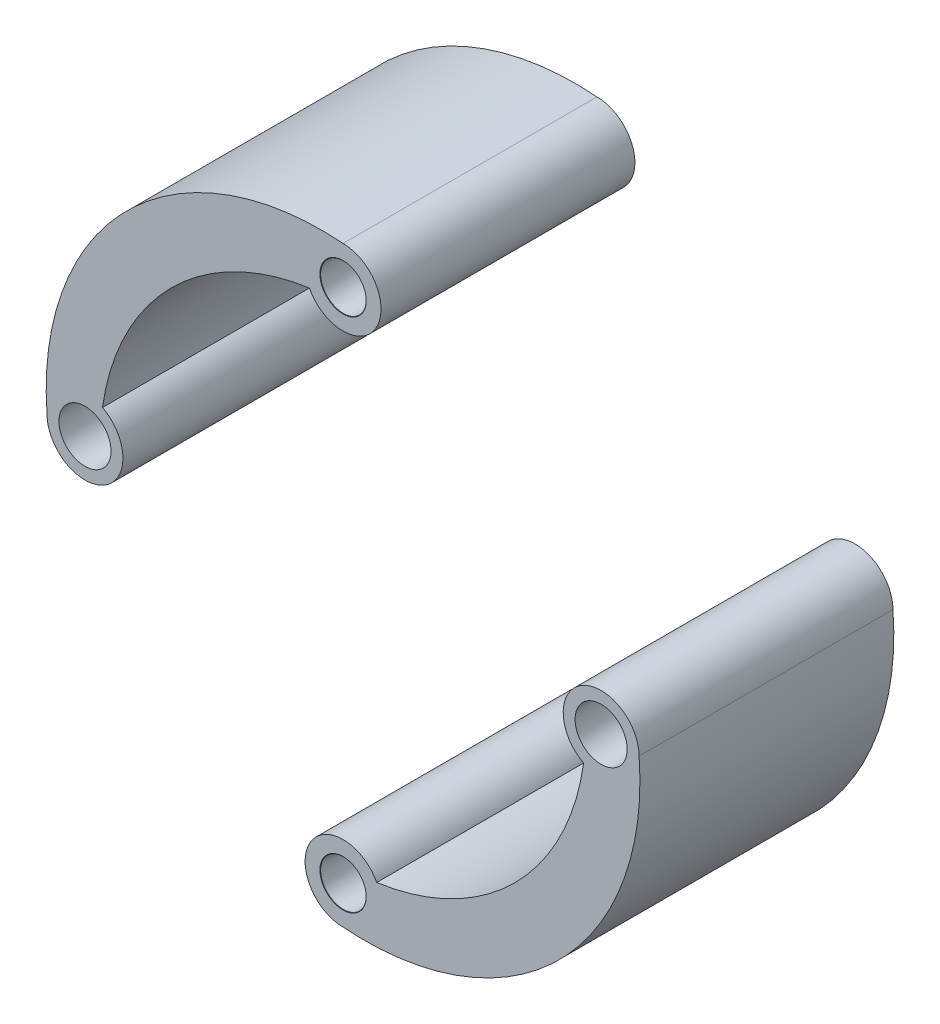
ISO-10303-21;
HEADER;
FILE_DESCRIPTION(('STEP AP214'),'2;1');
FILE_NAME('part.step','',(''),(''),'','','');
FILE_SCHEMA(('AUTOMOTIVE_DESIGN { 1 0 10303 214 1 1 1 1 }'));
ENDSEC;
DATA;
#1=APPLICATION_CONTEXT('core data for automotive mechanical design processes');
#2=APPLICATION_PROTOCOL_DEFINITION('international standard','automotive_design',2000,#1);
#3=PRODUCT_CONTEXT('',#1,'mechanical');
#4=PRODUCT('Part','Part','',(#3));
#5=PRODUCT_RELATED_PRODUCT_CATEGORY('part','',(#4));
#6=PRODUCT_DEFINITION_FORMATION('','',#4);
#7=PRODUCT_DEFINITION_CONTEXT('part definition',#1,'design');
#8=PRODUCT_DEFINITION('design','',#6,#7);
#9=PRODUCT_DEFINITION_SHAPE('','',#8);
#10=(LENGTH_UNIT() NAMED_UNIT(*) SI_UNIT(.MILLI.,.METRE.));
#11=(NAMED_UNIT(*) PLANE_ANGLE_UNIT() SI_UNIT($,.RADIAN.));
#12=(NAMED_UNIT(*) SI_UNIT($,.STERADIAN.) SOLID_ANGLE_UNIT());
#13=UNCERTAINTY_MEASURE_WITH_UNIT(LENGTH_MEASURE(1.E-05),#10,'distance_accuracy_value','');
#14=(GEOMETRIC_REPRESENTATION_CONTEXT(3) GLOBAL_UNCERTAINTY_ASSIGNED_CONTEXT((#13)) GLOBAL_UNIT_ASSIGNED_CONTEXT((#10,
#11,#12)) REPRESENTATION_CONTEXT('',''));
#15=CARTESIAN_POINT('',(0.,0.,0.));
#16=DIRECTION('',(0.,0.,1.));
#17=DIRECTION('',(1.,0.,0.));
#18=AXIS2_PLACEMENT_3D('',#15,#16,#17);
#19=CARTESIAN_POINT('',(0.,-17.,16.7224));
#20=DIRECTION('',(0.,0.,-1.));
#21=DIRECTION('',(-1.,0.,0.));
#22=AXIS2_PLACEMENT_3D('',#19,#20,#21);
#23=CYLINDRICAL_SURFACE('',#22,2.5);
#24=CARTESIAN_POINT('',(0.,-17.,0.));
#25=DIRECTION('',(0.,0.,1.));
#26=DIRECTION('',(1.,0.,0.));
#27=AXIS2_PLACEMENT_3D('',#24,#25,#26);
#28=CIRCLE('',#27,2.5);
#29=CARTESIAN_POINT('',(2.21750613922682,-15.8455882352941,0.));
#30=VERTEX_POINT('',#29);
#31=CARTESIAN_POINT('',(0.,-19.5,0.));
#32=VERTEX_POINT('',#31);
#33=EDGE_CURVE('E149',#30,#32,#28,.T.);
#34=ORIENTED_EDGE('',*,*,#33,.T.);
#35=DIRECTION('',(0.,0.,-1.));
#36=VECTOR('',#35,1.);
#37=CARTESIAN_POINT('',(0.,-19.5,16.7224));
#38=LINE('',#37,#36);
#39=CARTESIAN_POINT('',(0.,-19.5,16.7224));
#40=VERTEX_POINT('',#39);
#41=EDGE_CURVE('E13',#40,#32,#38,.T.);
#42=ORIENTED_EDGE('',*,*,#41,.F.);
#43=CARTESIAN_POINT('',(0.,-17.,16.7224));
#44=DIRECTION('',(0.,0.,1.));
#45=DIRECTION('',(1.,0.,0.));
#46=AXIS2_PLACEMENT_3D('',#43,#44,#45);
#47=CIRCLE('',#46,2.5);
#48=CARTESIAN_POINT('',(2.21750613922682,-15.8455882352941,16.7224));
#49=VERTEX_POINT('',#48);
#50=EDGE_CURVE('E133',#49,#40,#47,.T.);
#51=ORIENTED_EDGE('',*,*,#50,.F.);
#52=DIRECTION('',(0.,0.,-1.));
#53=VECTOR('',#52,1.);
#54=CARTESIAN_POINT('',(2.21750613922682,-15.8455882352941,16.7224));
#55=LINE('',#54,#53);
#56=EDGE_CURVE('E145',#49,#30,#55,.T.);
#57=ORIENTED_EDGE('',*,*,#56,.T.);
#58=EDGE_LOOP('',(#34,#42,#51,#57));
#59=FACE_BOUND('',#58,.T.);
#60=ADVANCED_FACE('F81',(#59),#23,.T.);
#61=CARTESIAN_POINT('',(1.4142135623731,-1.41421356237309,16.7224));
#62=DIRECTION('',(0.,0.,-1.));
#63=DIRECTION('',(-1.,0.,0.));
#64=AXIS2_PLACEMENT_3D('',#61,#62,#63);
#65=CYLINDRICAL_SURFACE('',#64,18.1409942138641);
#66=CARTESIAN_POINT('',(1.4142135623731,-1.41421356237309,0.));
#67=DIRECTION('',(0.,0.,1.));
#68=DIRECTION('',(1.,0.,0.));
#69=AXIS2_PLACEMENT_3D('',#66,#67,#68);
#70=CIRCLE('',#69,18.1409942138641);
#71=CARTESIAN_POINT('',(19.5,0.,0.));
#72=VERTEX_POINT('',#71);
#73=EDGE_CURVE('E138',#32,#72,#70,.T.);
#74=ORIENTED_EDGE('',*,*,#73,.T.);
#75=DIRECTION('',(0.,0.,-1.));
#76=VECTOR('',#75,1.);
#77=CARTESIAN_POINT('',(19.5,0.,16.7224));
#78=LINE('',#77,#76);
#79=CARTESIAN_POINT('',(19.5,0.,16.7224));
#80=VERTEX_POINT('',#79);
#81=EDGE_CURVE('E90',#80,#72,#78,.T.);
#82=ORIENTED_EDGE('',*,*,#81,.F.);
#83=CARTESIAN_POINT('',(1.4142135623731,-1.41421356237309,16.7224));
#84=DIRECTION('',(0.,0.,1.));
#85=DIRECTION('',(1.,0.,0.));
#86=AXIS2_PLACEMENT_3D('',#83,#84,#85);
#87=CIRCLE('',#86,18.1409942138641);
#88=EDGE_CURVE('E128',#40,#80,#87,.T.);
#89=ORIENTED_EDGE('',*,*,#88,.F.);
#90=ORIENTED_EDGE('',*,*,#41,.T.);
#91=EDGE_LOOP('',(#74,#82,#89,#90));
#92=FACE_BOUND('',#91,.T.);
#93=ADVANCED_FACE('F137',(#92),#65,.T.);
#94=CARTESIAN_POINT('',(17.,0.,16.7224));
#95=DIRECTION('',(0.,0.,-1.));
#96=DIRECTION('',(-1.,0.,0.));
#97=AXIS2_PLACEMENT_3D('',#94,#95,#96);
#98=CYLINDRICAL_SURFACE('',#97,2.5);
#99=CARTESIAN_POINT('',(17.,0.,0.));
#100=DIRECTION('',(0.,0.,1.));
#101=DIRECTION('',(1.,0.,0.));
#102=AXIS2_PLACEMENT_3D('',#99,#100,#101);
#103=CIRCLE('',#102,2.5);
#104=CARTESIAN_POINT('',(15.8455882352941,-2.21750613922682,0.));
#105=VERTEX_POINT('',#104);
#106=EDGE_CURVE('E115',#72,#105,#103,.T.);
#107=ORIENTED_EDGE('',*,*,#106,.T.);
#108=DIRECTION('',(0.,0.,-1.));
#109=VECTOR('',#108,1.);
#110=CARTESIAN_POINT('',(15.8455882352941,-2.21750613922682,16.7224));
#111=LINE('',#110,#109);
#112=CARTESIAN_POINT('',(15.8455882352941,-2.21750613922682,16.7224));
#113=VERTEX_POINT('',#112);
#114=EDGE_CURVE('E140',#113,#105,#111,.T.);
#115=ORIENTED_EDGE('',*,*,#114,.F.);
#116=CARTESIAN_POINT('',(17.,0.,16.7224));
#117=DIRECTION('',(0.,0.,1.));
#118=DIRECTION('',(1.,0.,0.));
#119=AXIS2_PLACEMENT_3D('',#116,#117,#118);
#120=CIRCLE('',#119,2.5);
#121=EDGE_CURVE('E131',#80,#113,#120,.T.);
#122=ORIENTED_EDGE('',*,*,#121,.F.);
#123=ORIENTED_EDGE('',*,*,#81,.T.);
#124=EDGE_LOOP('',(#107,#115,#122,#123));
#125=FACE_BOUND('',#124,.T.);
#126=ADVANCED_FACE('F141',(#125),#98,.T.);
#127=CARTESIAN_POINT('',(0.,0.,16.7224));
#128=DIRECTION('',(0.,0.,-1.));
#129=DIRECTION('',(-1.,0.,0.));
#130=AXIS2_PLACEMENT_3D('',#127,#128,#129);
#131=CYLINDRICAL_SURFACE('',#130,16.);
#132=CARTESIAN_POINT('',(0.,0.,0.));
#133=DIRECTION('',(0.,0.,1.));
#134=DIRECTION('',(1.,0.,0.));
#135=AXIS2_PLACEMENT_3D('',#132,#133,#134);
#136=CIRCLE('',#135,16.);
#137=EDGE_CURVE('E121',#105,#30,#136,.F.);
#138=ORIENTED_EDGE('',*,*,#137,.T.);
#139=ORIENTED_EDGE('',*,*,#56,.F.);
#140=CARTESIAN_POINT('',(0.,0.,16.7224));
#141=DIRECTION('',(0.,0.,1.));
#142=DIRECTION('',(1.,0.,0.));
#143=AXIS2_PLACEMENT_3D('',#140,#141,#142);
#144=CIRCLE('',#143,16.);
#145=EDGE_CURVE('E98',#113,#49,#144,.F.);
#146=ORIENTED_EDGE('',*,*,#145,.F.);
#147=ORIENTED_EDGE('',*,*,#114,.T.);
#148=EDGE_LOOP('',(#138,#139,#146,#147));
#149=FACE_BOUND('',#148,.T.);
#150=ADVANCED_FACE('F163',(#149),#131,.F.);
#151=CARTESIAN_POINT('',(0.,0.,16.7224));
#152=DIRECTION('',(0.,0.,1.));
#153=DIRECTION('',(1.,0.,0.));
#154=AXIS2_PLACEMENT_3D('',#151,#152,#153);
#155=PLANE('',#154);
#156=CARTESIAN_POINT('',(17.,0.,16.7224));
#157=DIRECTION('',(0.,0.,1.));
#158=DIRECTION('',(1.,0.,0.));
#159=AXIS2_PLACEMENT_3D('',#156,#157,#158);
#160=CIRCLE('',#159,1.715);
#161=CARTESIAN_POINT('',(18.715,0.,16.7224));
#162=VERTEX_POINT('',#161);
#163=EDGE_CURVE('E181',#162,#162,#160,.T.);
#164=ORIENTED_EDGE('',*,*,#163,.F.);
#165=EDGE_LOOP('',(#164));
#166=FACE_BOUND('',#165,.T.);
#167=CARTESIAN_POINT('',(0.,-17.,16.7224));
#168=DIRECTION('',(0.,0.,1.));
#169=DIRECTION('',(1.,0.,0.));
#170=AXIS2_PLACEMENT_3D('',#167,#168,#169);
#171=CIRCLE('',#170,1.525);
#172=CARTESIAN_POINT('',(1.525,-17.,16.7224));
#173=VERTEX_POINT('',#172);
#174=EDGE_CURVE('E177',#173,#173,#171,.T.);
#175=ORIENTED_EDGE('',*,*,#174,.F.);
#176=EDGE_LOOP('',(#175));
#177=FACE_BOUND('',#176,.T.);
#178=ORIENTED_EDGE('',*,*,#50,.T.);
#179=ORIENTED_EDGE('',*,*,#88,.T.);
#180=ORIENTED_EDGE('',*,*,#121,.T.);
#181=ORIENTED_EDGE('',*,*,#145,.T.);
#182=EDGE_LOOP('',(#178,#179,#180,#181));
#183=FACE_BOUND('',#182,.T.);
#184=ADVANCED_FACE('F129',(#166,#177,#183),#155,.T.);
#185=CARTESIAN_POINT('',(0.,0.,0.));
#186=DIRECTION('',(0.,0.,1.));
#187=DIRECTION('',(1.,0.,0.));
#188=AXIS2_PLACEMENT_3D('',#185,#186,#187);
#189=PLANE('',#188);
#190=CARTESIAN_POINT('',(17.,0.,0.));
#191=DIRECTION('',(0.,0.,-1.));
#192=DIRECTION('',(-1.,0.,0.));
#193=AXIS2_PLACEMENT_3D('',#190,#191,#192);
#194=CIRCLE('',#193,1.715);
#195=CARTESIAN_POINT('',(15.285,0.,0.));
#196=VERTEX_POINT('',#195);
#197=EDGE_CURVE('E186',#196,#196,#194,.T.);
#198=ORIENTED_EDGE('',*,*,#197,.F.);
#199=EDGE_LOOP('',(#198));
#200=FACE_BOUND('',#199,.T.);
#201=CARTESIAN_POINT('',(0.,-17.,0.));
#202=DIRECTION('',(0.,0.,1.));
#203=DIRECTION('',(1.,0.,0.));
#204=AXIS2_PLACEMENT_3D('',#201,#202,#203);
#205=CIRCLE('',#204,1.5);
#206=CARTESIAN_POINT('',(1.5,-17.,0.));
#207=VERTEX_POINT('',#206);
#208=EDGE_CURVE('E153',#207,#207,#205,.T.);
#209=ORIENTED_EDGE('',*,*,#208,.T.);
#210=EDGE_LOOP('',(#209));
#211=FACE_BOUND('',#210,.T.);
#212=ORIENTED_EDGE('',*,*,#33,.F.);
#213=ORIENTED_EDGE('',*,*,#137,.F.);
#214=ORIENTED_EDGE('',*,*,#106,.F.);
#215=ORIENTED_EDGE('',*,*,#73,.F.);
#216=EDGE_LOOP('',(#212,#213,#214,#215));
#217=FACE_BOUND('',#216,.T.);
#218=ADVANCED_FACE('F166',(#200,#211,#217),#189,.F.);
#219=CARTESIAN_POINT('',(0.,-17.,16.7224));
#220=DIRECTION('',(0.,0.,1.));
#221=DIRECTION('',(1.,0.,0.));
#222=AXIS2_PLACEMENT_3D('',#219,#220,#221);
#223=CYLINDRICAL_SURFACE('',#222,1.5);
#224=ORIENTED_EDGE('',*,*,#208,.F.);
#225=EDGE_LOOP('',(#224));
#226=FACE_BOUND('',#225,.T.);
#227=CARTESIAN_POINT('',(0.,-17.,16.7014225092206));
#228=DIRECTION('',(0.,0.,1.));
#229=DIRECTION('',(1.,0.,0.));
#230=AXIS2_PLACEMENT_3D('',#227,#228,#229);
#231=CIRCLE('',#230,1.5);
#232=CARTESIAN_POINT('',(1.5,-17.,16.7014225092206));
#233=VERTEX_POINT('',#232);
#234=EDGE_CURVE('E173',#233,#233,#231,.T.);
#235=ORIENTED_EDGE('',*,*,#234,.T.);
#236=EDGE_LOOP('',(#235));
#237=FACE_BOUND('',#236,.T.);
#238=ADVANCED_FACE('F202',(#226,#237),#223,.F.);
#239=CARTESIAN_POINT('',(0.,-17.,16.7224));
#240=DIRECTION('',(0.,0.,1.));
#241=DIRECTION('',(1.,0.,0.));
#242=AXIS2_PLACEMENT_3D('',#239,#240,#241);
#243=CONICAL_SURFACE('',#242,1.525,0.872664625997111);
#244=ORIENTED_EDGE('',*,*,#234,.F.);
#245=EDGE_LOOP('',(#244));
#246=FACE_BOUND('',#245,.T.);
#247=ORIENTED_EDGE('',*,*,#174,.T.);
#248=EDGE_LOOP('',(#247));
#249=FACE_BOUND('',#248,.T.);
#250=ADVANCED_FACE('F208',(#246,#249),#243,.F.);
#251=CARTESIAN_POINT('',(17.,0.,11.7224));
#252=DIRECTION('',(0.,0.,1.));
#253=DIRECTION('',(1.,0.,0.));
#254=AXIS2_PLACEMENT_3D('',#251,#252,#253);
#255=CYLINDRICAL_SURFACE('',#254,1.715);
#256=CARTESIAN_POINT('',(17.,0.,11.7224));
#257=DIRECTION('',(0.,0.,1.));
#258=DIRECTION('',(1.,0.,0.));
#259=AXIS2_PLACEMENT_3D('',#256,#257,#258);
#260=CIRCLE('',#259,1.715);
#261=CARTESIAN_POINT('',(18.715,0.,11.7224));
#262=VERTEX_POINT('',#261);
#263=EDGE_CURVE('E182',#262,#262,#260,.T.);
#264=ORIENTED_EDGE('',*,*,#263,.F.);
#265=EDGE_LOOP('',(#264));
#266=FACE_BOUND('',#265,.T.);
#267=ORIENTED_EDGE('',*,*,#163,.T.);
#268=EDGE_LOOP('',(#267));
#269=FACE_BOUND('',#268,.T.);
#270=ADVANCED_FACE('F214',(#266,#269),#255,.F.);
#271=CARTESIAN_POINT('',(17.,0.,11.7224));
#272=DIRECTION('',(0.,0.,1.));
#273=DIRECTION('',(1.,0.,0.));
#274=AXIS2_PLACEMENT_3D('',#271,#272,#273);
#275=PLANE('',#274);
#276=ORIENTED_EDGE('',*,*,#263,.T.);
#277=EDGE_LOOP('',(#276));
#278=FACE_BOUND('',#277,.T.);
#279=ADVANCED_FACE('F263',(#278),#275,.T.);
#280=CARTESIAN_POINT('',(17.,0.,5.));
#281=DIRECTION('',(0.,0.,-1.));
#282=DIRECTION('',(-1.,0.,0.));
#283=AXIS2_PLACEMENT_3D('',#280,#281,#282);
#284=CYLINDRICAL_SURFACE('',#283,1.715);
#285=CARTESIAN_POINT('',(17.,0.,5.));
#286=DIRECTION('',(0.,0.,-1.));
#287=DIRECTION('',(-1.,0.,0.));
#288=AXIS2_PLACEMENT_3D('',#285,#286,#287);
#289=CIRCLE('',#288,1.715);
#290=CARTESIAN_POINT('',(15.285,0.,5.));
#291=VERTEX_POINT('',#290);
#292=EDGE_CURVE('E190',#291,#291,#289,.T.);
#293=ORIENTED_EDGE('',*,*,#292,.F.);
#294=EDGE_LOOP('',(#293));
#295=FACE_BOUND('',#294,.T.);
#296=ORIENTED_EDGE('',*,*,#197,.T.);
#297=EDGE_LOOP('',(#296));
#298=FACE_BOUND('',#297,.T.);
#299=ADVANCED_FACE('F198',(#295,#298),#284,.F.);
#300=CARTESIAN_POINT('',(17.,0.,5.));
#301=DIRECTION('',(0.,0.,-1.));
#302=DIRECTION('',(-1.,0.,0.));
#303=AXIS2_PLACEMENT_3D('',#300,#301,#302);
#304=PLANE('',#303);
#305=ORIENTED_EDGE('',*,*,#292,.T.);
#306=EDGE_LOOP('',(#305));
#307=FACE_BOUND('',#306,.T.);
#308=ADVANCED_FACE('F282',(#307),#304,.T.);
#309=CLOSED_SHELL('',(#60,#93,#126,#150,#184,#218,#238,#250,#270,#279,#299,#308));
#310=MANIFOLD_SOLID_BREP('B2',#309);
#311=CARTESIAN_POINT('',(-17.,0.,16.7224));
#312=DIRECTION('',(0.,0.,-1.));
#313=DIRECTION('',(-1.,0.,0.));
#314=AXIS2_PLACEMENT_3D('',#311,#312,#313);
#315=CYLINDRICAL_SURFACE('',#314,2.5);
#316=CARTESIAN_POINT('',(-17.,0.,0.));
#317=DIRECTION('',(0.,0.,1.));
#318=DIRECTION('',(1.,0.,0.));
#319=AXIS2_PLACEMENT_3D('',#316,#317,#318);
#320=CIRCLE('',#319,2.5);
#321=CARTESIAN_POINT('',(-19.5,0.,0.));
#322=VERTEX_POINT('',#321);
#323=CARTESIAN_POINT('',(-15.8455882352941,2.21750613922682,0.));
#324=VERTEX_POINT('',#323);
#325=EDGE_CURVE('E395',#322,#324,#320,.T.);
#326=ORIENTED_EDGE('',*,*,#325,.T.);
#327=DIRECTION('',(0.,0.,-1.));
#328=VECTOR('',#327,1.);
#329=CARTESIAN_POINT('',(-15.8455882352941,2.21750613922682,16.7224));
#330=LINE('',#329,#328);
#331=CARTESIAN_POINT('',(-15.8455882352941,2.21750613922682,16.7224));
#332=VERTEX_POINT('',#331);
#333=EDGE_CURVE('E79',#332,#324,#330,.T.);
#334=ORIENTED_EDGE('',*,*,#333,.F.);
#335=CARTESIAN_POINT('',(-17.,0.,16.7224));
#336=DIRECTION('',(0.,0.,1.));
#337=DIRECTION('',(1.,0.,0.));
#338=AXIS2_PLACEMENT_3D('',#335,#336,#337);
#339=CIRCLE('',#338,2.5);
#340=CARTESIAN_POINT('',(-19.5,0.,16.7224));
#341=VERTEX_POINT('',#340);
#342=EDGE_CURVE('E381',#341,#332,#339,.T.);
#343=ORIENTED_EDGE('',*,*,#342,.F.);
#344=DIRECTION('',(0.,0.,-1.));
#345=VECTOR('',#344,1.);
#346=CARTESIAN_POINT('',(-19.5,0.,16.7224));
#347=LINE('',#346,#345);
#348=EDGE_CURVE('E348',#341,#322,#347,.T.);
#349=ORIENTED_EDGE('',*,*,#348,.T.);
#350=EDGE_LOOP('',(#326,#334,#343,#349));
#351=FACE_BOUND('',#350,.T.);
#352=ADVANCED_FACE('F332',(#351),#315,.T.);
#353=CARTESIAN_POINT('',(0.,0.,16.7224));
#354=DIRECTION('',(0.,0.,-1.));
#355=DIRECTION('',(-1.,0.,0.));
#356=AXIS2_PLACEMENT_3D('',#353,#354,#355);
#357=CYLINDRICAL_SURFACE('',#356,16.);
#358=CARTESIAN_POINT('',(0.,0.,0.));
#359=DIRECTION('',(0.,0.,1.));
#360=DIRECTION('',(1.,0.,0.));
#361=AXIS2_PLACEMENT_3D('',#358,#359,#360);
#362=CIRCLE('',#361,16.);
#363=CARTESIAN_POINT('',(-2.21750613922682,15.8455882352941,0.));
#364=VERTEX_POINT('',#363);
#365=EDGE_CURVE('E386',#324,#364,#362,.F.);
#366=ORIENTED_EDGE('',*,*,#365,.T.);
#367=DIRECTION('',(0.,0.,-1.));
#368=VECTOR('',#367,1.);
#369=CARTESIAN_POINT('',(-2.21750613922682,15.8455882352941,16.7224));
#370=LINE('',#369,#368);
#371=CARTESIAN_POINT('',(-2.21750613922682,15.8455882352941,16.7224));
#372=VERTEX_POINT('',#371);
#373=EDGE_CURVE('E340',#372,#364,#370,.T.);
#374=ORIENTED_EDGE('',*,*,#373,.F.);
#375=CARTESIAN_POINT('',(0.,0.,16.7224));
#376=DIRECTION('',(0.,0.,1.));
#377=DIRECTION('',(1.,0.,0.));
#378=AXIS2_PLACEMENT_3D('',#375,#376,#377);
#379=CIRCLE('',#378,16.);
#380=EDGE_CURVE('E374',#332,#372,#379,.F.);
#381=ORIENTED_EDGE('',*,*,#380,.F.);
#382=ORIENTED_EDGE('',*,*,#333,.T.);
#383=EDGE_LOOP('',(#366,#374,#381,#382));
#384=FACE_BOUND('',#383,.T.);
#385=ADVANCED_FACE('F385',(#384),#357,.F.);
#386=CARTESIAN_POINT('',(0.,17.,16.7224));
#387=DIRECTION('',(0.,0.,-1.));
#388=DIRECTION('',(-1.,0.,0.));
#389=AXIS2_PLACEMENT_3D('',#386,#387,#388);
#390=CYLINDRICAL_SURFACE('',#389,2.5);
#391=CARTESIAN_POINT('',(0.,17.,0.));
#392=DIRECTION('',(0.,0.,1.));
#393=DIRECTION('',(1.,0.,0.));
#394=AXIS2_PLACEMENT_3D('',#391,#392,#393);
#395=CIRCLE('',#394,2.5);
#396=CARTESIAN_POINT('',(0.,19.5,0.));
#397=VERTEX_POINT('',#396);
#398=EDGE_CURVE('E399',#364,#397,#395,.T.);
#399=ORIENTED_EDGE('',*,*,#398,.T.);
#400=DIRECTION('',(0.,0.,-1.));
#401=VECTOR('',#400,1.);
#402=CARTESIAN_POINT('',(0.,19.5,16.7224));
#403=LINE('',#402,#401);
#404=CARTESIAN_POINT('',(0.,19.5,16.7224));
#405=VERTEX_POINT('',#404);
#406=EDGE_CURVE('E363',#405,#397,#403,.T.);
#407=ORIENTED_EDGE('',*,*,#406,.F.);
#408=CARTESIAN_POINT('',(0.,17.,16.7224));
#409=DIRECTION('',(0.,0.,1.));
#410=DIRECTION('',(1.,0.,0.));
#411=AXIS2_PLACEMENT_3D('',#408,#409,#410);
#412=CIRCLE('',#411,2.5);
#413=EDGE_CURVE('E380',#372,#405,#412,.T.);
#414=ORIENTED_EDGE('',*,*,#413,.F.);
#415=ORIENTED_EDGE('',*,*,#373,.T.);
#416=EDGE_LOOP('',(#399,#407,#414,#415));
#417=FACE_BOUND('',#416,.T.);
#418=ADVANCED_FACE('F389',(#417),#390,.T.);
#419=CARTESIAN_POINT('',(-1.41421356237309,1.41421356237309,16.7224));
#420=DIRECTION('',(0.,0.,-1.));
#421=DIRECTION('',(-1.,0.,0.));
#422=AXIS2_PLACEMENT_3D('',#419,#420,#421);
#423=CYLINDRICAL_SURFACE('',#422,18.1409942138641);
#424=CARTESIAN_POINT('',(-1.41421356237309,1.41421356237309,0.));
#425=DIRECTION('',(0.,0.,1.));
#426=DIRECTION('',(1.,0.,0.));
#427=AXIS2_PLACEMENT_3D('',#424,#425,#426);
#428=CIRCLE('',#427,18.1409942138641);
#429=EDGE_CURVE('E401',#322,#397,#428,.F.);
#430=ORIENTED_EDGE('',*,*,#429,.F.);
#431=ORIENTED_EDGE('',*,*,#348,.F.);
#432=CARTESIAN_POINT('',(-1.41421356237309,1.41421356237309,16.7224));
#433=DIRECTION('',(0.,0.,1.));
#434=DIRECTION('',(1.,0.,0.));
#435=AXIS2_PLACEMENT_3D('',#432,#433,#434);
#436=CIRCLE('',#435,18.1409942138641);
#437=EDGE_CURVE('E390',#341,#405,#436,.F.);
#438=ORIENTED_EDGE('',*,*,#437,.T.);
#439=ORIENTED_EDGE('',*,*,#406,.T.);
#440=EDGE_LOOP('',(#430,#431,#438,#439));
#441=FACE_BOUND('',#440,.T.);
#442=ADVANCED_FACE('F443',(#441),#423,.T.);
#443=CARTESIAN_POINT('',(0.,0.,16.7224));
#444=DIRECTION('',(0.,0.,1.));
#445=DIRECTION('',(1.,0.,0.));
#446=AXIS2_PLACEMENT_3D('',#443,#444,#445);
#447=PLANE('',#446);
#448=CARTESIAN_POINT('',(-17.,0.,16.7224));
#449=DIRECTION('',(0.,0.,1.));
#450=DIRECTION('',(1.,0.,0.));
#451=AXIS2_PLACEMENT_3D('',#448,#449,#450);
#452=CIRCLE('',#451,1.715);
#453=CARTESIAN_POINT('',(-15.285,0.,16.7224));
#454=VERTEX_POINT('',#453);
#455=EDGE_CURVE('E416',#454,#454,#452,.T.);
#456=ORIENTED_EDGE('',*,*,#455,.F.);
#457=EDGE_LOOP('',(#456));
#458=FACE_BOUND('',#457,.T.);
#459=CARTESIAN_POINT('',(0.,17.,16.7224));
#460=DIRECTION('',(0.,0.,1.));
#461=DIRECTION('',(1.,0.,0.));
#462=AXIS2_PLACEMENT_3D('',#459,#460,#461);
#463=CIRCLE('',#462,1.525);
#464=CARTESIAN_POINT('',(1.525,17.,16.7224));
#465=VERTEX_POINT('',#464);
#466=EDGE_CURVE('E412',#465,#465,#463,.T.);
#467=ORIENTED_EDGE('',*,*,#466,.F.);
#468=EDGE_LOOP('',(#467));
#469=FACE_BOUND('',#468,.T.);
#470=ORIENTED_EDGE('',*,*,#342,.T.);
#471=ORIENTED_EDGE('',*,*,#380,.T.);
#472=ORIENTED_EDGE('',*,*,#413,.T.);
#473=ORIENTED_EDGE('',*,*,#437,.F.);
#474=EDGE_LOOP('',(#470,#471,#472,#473));
#475=FACE_BOUND('',#474,.T.);
#476=ADVANCED_FACE('F377',(#458,#469,#475),#447,.T.);
#477=CARTESIAN_POINT('',(0.,0.,0.));
#478=DIRECTION('',(0.,0.,1.));
#479=DIRECTION('',(1.,0.,0.));
#480=AXIS2_PLACEMENT_3D('',#477,#478,#479);
#481=PLANE('',#480);
#482=CARTESIAN_POINT('',(-17.,0.,0.));
#483=DIRECTION('',(0.,0.,-1.));
#484=DIRECTION('',(-1.,0.,0.));
#485=AXIS2_PLACEMENT_3D('',#482,#483,#484);
#486=CIRCLE('',#485,1.715);
#487=CARTESIAN_POINT('',(-18.715,0.,0.));
#488=VERTEX_POINT('',#487);
#489=EDGE_CURVE('E422',#488,#488,#486,.T.);
#490=ORIENTED_EDGE('',*,*,#489,.F.);
#491=EDGE_LOOP('',(#490));
#492=FACE_BOUND('',#491,.T.);
#493=CARTESIAN_POINT('',(0.,17.,0.));
#494=DIRECTION('',(0.,0.,1.));
#495=DIRECTION('',(1.,0.,0.));
#496=AXIS2_PLACEMENT_3D('',#493,#494,#495);
#497=CIRCLE('',#496,1.5);
#498=CARTESIAN_POINT('',(1.5,17.,0.));
#499=VERTEX_POINT('',#498);
#500=EDGE_CURVE('E397',#499,#499,#497,.T.);
#501=ORIENTED_EDGE('',*,*,#500,.T.);
#502=EDGE_LOOP('',(#501));
#503=FACE_BOUND('',#502,.T.);
#504=ORIENTED_EDGE('',*,*,#325,.F.);
#505=ORIENTED_EDGE('',*,*,#429,.T.);
#506=ORIENTED_EDGE('',*,*,#398,.F.);
#507=ORIENTED_EDGE('',*,*,#365,.F.);
#508=EDGE_LOOP('',(#504,#505,#506,#507));
#509=FACE_BOUND('',#508,.T.);
#510=ADVANCED_FACE('F437',(#492,#503,#509),#481,.F.);
#511=CARTESIAN_POINT('',(0.,17.,16.7224));
#512=DIRECTION('',(0.,0.,1.));
#513=DIRECTION('',(1.,0.,0.));
#514=AXIS2_PLACEMENT_3D('',#511,#512,#513);
#515=CYLINDRICAL_SURFACE('',#514,1.5);
#516=ORIENTED_EDGE('',*,*,#500,.F.);
#517=EDGE_LOOP('',(#516));
#518=FACE_BOUND('',#517,.T.);
#519=CARTESIAN_POINT('',(0.,17.,16.7014225092206));
#520=DIRECTION('',(0.,0.,1.));
#521=DIRECTION('',(1.,0.,0.));
#522=AXIS2_PLACEMENT_3D('',#519,#520,#521);
#523=CIRCLE('',#522,1.5);
#524=CARTESIAN_POINT('',(1.5,17.,16.7014225092206));
#525=VERTEX_POINT('',#524);
#526=EDGE_CURVE('E409',#525,#525,#523,.T.);
#527=ORIENTED_EDGE('',*,*,#526,.T.);
#528=EDGE_LOOP('',(#527));
#529=FACE_BOUND('',#528,.T.);
#530=ADVANCED_FACE('F440',(#518,#529),#515,.F.);
#531=CARTESIAN_POINT('',(0.,17.,16.7224));
#532=DIRECTION('',(0.,0.,1.));
#533=DIRECTION('',(1.,0.,0.));
#534=AXIS2_PLACEMENT_3D('',#531,#532,#533);
#535=CONICAL_SURFACE('',#534,1.525,0.872664625997111);
#536=ORIENTED_EDGE('',*,*,#526,.F.);
#537=EDGE_LOOP('',(#536));
#538=FACE_BOUND('',#537,.T.);
#539=ORIENTED_EDGE('',*,*,#466,.T.);
#540=EDGE_LOOP('',(#539));
#541=FACE_BOUND('',#540,.T.);
#542=ADVANCED_FACE('F505',(#538,#541),#535,.F.);
#543=CARTESIAN_POINT('',(-17.,0.,11.7224));
#544=DIRECTION('',(0.,0.,1.));
#545=DIRECTION('',(1.,0.,0.));
#546=AXIS2_PLACEMENT_3D('',#543,#544,#545);
#547=CYLINDRICAL_SURFACE('',#546,1.715);
#548=CARTESIAN_POINT('',(-17.,0.,11.7224));
#549=DIRECTION('',(0.,0.,1.));
#550=DIRECTION('',(1.,0.,0.));
#551=AXIS2_PLACEMENT_3D('',#548,#549,#550);
#552=CIRCLE('',#551,1.715);
#553=CARTESIAN_POINT('',(-15.285,0.,11.7224));
#554=VERTEX_POINT('',#553);
#555=EDGE_CURVE('E415',#554,#554,#552,.T.);
#556=ORIENTED_EDGE('',*,*,#555,.F.);
#557=EDGE_LOOP('',(#556));
#558=FACE_BOUND('',#557,.T.);
#559=ORIENTED_EDGE('',*,*,#455,.T.);
#560=EDGE_LOOP('',(#559));
#561=FACE_BOUND('',#560,.T.);
#562=ADVANCED_FACE('F514',(#558,#561),#547,.F.);
#563=CARTESIAN_POINT('',(-17.,0.,11.7224));
#564=DIRECTION('',(0.,0.,1.));
#565=DIRECTION('',(1.,0.,0.));
#566=AXIS2_PLACEMENT_3D('',#563,#564,#565);
#567=PLANE('',#566);
#568=ORIENTED_EDGE('',*,*,#555,.T.);
#569=EDGE_LOOP('',(#568));
#570=FACE_BOUND('',#569,.T.);
#571=ADVANCED_FACE('F433',(#570),#567,.T.);
#572=CARTESIAN_POINT('',(-17.,0.,5.));
#573=DIRECTION('',(0.,0.,-1.));
#574=DIRECTION('',(-1.,0.,0.));
#575=AXIS2_PLACEMENT_3D('',#572,#573,#574);
#576=CYLINDRICAL_SURFACE('',#575,1.715);
#577=CARTESIAN_POINT('',(-17.,0.,5.));
#578=DIRECTION('',(0.,0.,-1.));
#579=DIRECTION('',(-1.,0.,0.));
#580=AXIS2_PLACEMENT_3D('',#577,#578,#579);
#581=CIRCLE('',#580,1.715);
#582=CARTESIAN_POINT('',(-18.715,0.,5.));
#583=VERTEX_POINT('',#582);
#584=EDGE_CURVE('E419',#583,#583,#581,.T.);
#585=ORIENTED_EDGE('',*,*,#584,.F.);
#586=EDGE_LOOP('',(#585));
#587=FACE_BOUND('',#586,.T.);
#588=ORIENTED_EDGE('',*,*,#489,.T.);
#589=EDGE_LOOP('',(#588));
#590=FACE_BOUND('',#589,.T.);
#591=ADVANCED_FACE('F430',(#587,#590),#576,.F.);
#592=CARTESIAN_POINT('',(-17.,0.,5.));
#593=DIRECTION('',(0.,0.,-1.));
#594=DIRECTION('',(-1.,0.,0.));
#595=AXIS2_PLACEMENT_3D('',#592,#593,#594);
#596=PLANE('',#595);
#597=ORIENTED_EDGE('',*,*,#584,.T.);
#598=EDGE_LOOP('',(#597));
#599=FACE_BOUND('',#598,.T.);
#600=ADVANCED_FACE('F428',(#599),#596,.T.);
#601=CLOSED_SHELL('',(#352,#385,#418,#442,#476,#510,#530,#542,#562,#571,#591,#600));
#602=MANIFOLD_SOLID_BREP('B7',#601);
#603=ADVANCED_BREP_SHAPE_REPRESENTATION('',(#18,#310,#602),#14);
#604=SHAPE_DEFINITION_REPRESENTATION(#9,#603);
ENDSEC;
END-ISO-10303-21;
